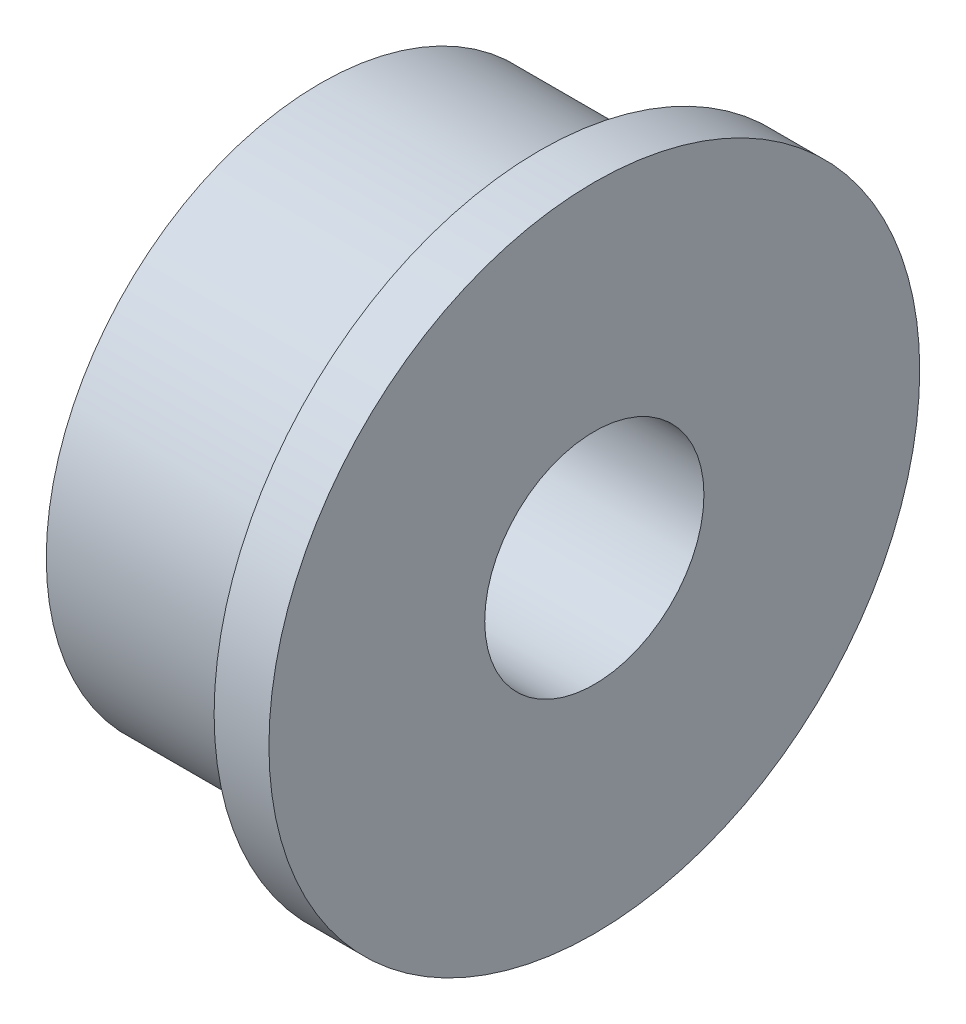
ISO-10303-21;
HEADER;
FILE_DESCRIPTION(('STEP AP214'),'2;1');
FILE_NAME('part.step','',(''),(''),'','','');
FILE_SCHEMA(('AUTOMOTIVE_DESIGN { 1 0 10303 214 1 1 1 1 }'));
ENDSEC;
DATA;
#1=APPLICATION_CONTEXT('core data for automotive mechanical design processes');
#2=APPLICATION_PROTOCOL_DEFINITION('international standard','automotive_design',2000,#1);
#3=PRODUCT_CONTEXT('',#1,'mechanical');
#4=PRODUCT('Part','Part','',(#3));
#5=PRODUCT_RELATED_PRODUCT_CATEGORY('part','',(#4));
#6=PRODUCT_DEFINITION_FORMATION('','',#4);
#7=PRODUCT_DEFINITION_CONTEXT('part definition',#1,'design');
#8=PRODUCT_DEFINITION('design','',#6,#7);
#9=PRODUCT_DEFINITION_SHAPE('','',#8);
#10=(LENGTH_UNIT() NAMED_UNIT(*) SI_UNIT(.MILLI.,.METRE.));
#11=(NAMED_UNIT(*) PLANE_ANGLE_UNIT() SI_UNIT($,.RADIAN.));
#12=(NAMED_UNIT(*) SI_UNIT($,.STERADIAN.) SOLID_ANGLE_UNIT());
#13=UNCERTAINTY_MEASURE_WITH_UNIT(LENGTH_MEASURE(1.E-05),#10,'distance_accuracy_value','');
#14=(GEOMETRIC_REPRESENTATION_CONTEXT(3) GLOBAL_UNCERTAINTY_ASSIGNED_CONTEXT((#13)) GLOBAL_UNIT_ASSIGNED_CONTEXT((#10,
#11,#12)) REPRESENTATION_CONTEXT('',''));
#15=CARTESIAN_POINT('',(0.,0.,0.));
#16=DIRECTION('',(0.,0.,1.));
#17=DIRECTION('',(1.,0.,0.));
#18=AXIS2_PLACEMENT_3D('',#15,#16,#17);
#19=CARTESIAN_POINT('',(-14.3753340595286,1.34629579981506,25.8752462228337));
#20=DIRECTION('',(1.,0.,0.));
#21=DIRECTION('',(0.,1.,0.));
#22=AXIS2_PLACEMENT_3D('',#19,#20,#21);
#23=CYLINDRICAL_SURFACE('',#22,1.6);
#24=CARTESIAN_POINT('',(-12.3753340595286,1.34629579981504,25.8752462228327));
#25=DIRECTION('',(-1.,0.,0.));
#26=DIRECTION('',(0.,0.,-1.));
#27=AXIS2_PLACEMENT_3D('',#24,#25,#26);
#28=CIRCLE('',#27,1.60000000000006);
#29=CARTESIAN_POINT('',(-12.3753340595286,1.34629579981506,24.2752462228326));
#30=VERTEX_POINT('',#29);
#31=EDGE_CURVE('E10',#30,#30,#28,.T.);
#32=ORIENTED_EDGE('',*,*,#31,.F.);
#33=EDGE_LOOP('',(#32));
#34=FACE_BOUND('',#33,.T.);
#35=CARTESIAN_POINT('',(-16.3753340595286,1.34629579981505,25.8752462228327));
#36=DIRECTION('',(1.,0.,0.));
#37=DIRECTION('',(0.,0.,-1.));
#38=AXIS2_PLACEMENT_3D('',#35,#36,#37);
#39=CIRCLE('',#38,1.6);
#40=CARTESIAN_POINT('',(-16.3753340595286,1.34629579981506,24.2752462228327));
#41=VERTEX_POINT('',#40);
#42=EDGE_CURVE('E39',#41,#41,#39,.T.);
#43=ORIENTED_EDGE('',*,*,#42,.F.);
#44=EDGE_LOOP('',(#43));
#45=FACE_BOUND('',#44,.T.);
#46=ADVANCED_FACE('F15',(#34,#45),#23,.F.);
#47=CARTESIAN_POINT('',(-13.1753340595286,7.04653579981503,31.5754862228327));
#48=DIRECTION('',(-1.,0.,0.));
#49=DIRECTION('',(0.,0.,1.));
#50=AXIS2_PLACEMENT_3D('',#47,#48,#49);
#51=PLANE('',#50);
#52=CARTESIAN_POINT('',(-13.1753340595286,1.34629579981505,25.8752462228327));
#53=DIRECTION('',(-1.,0.,0.));
#54=DIRECTION('',(0.,0.,1.));
#55=AXIS2_PLACEMENT_3D('',#52,#53,#54);
#56=CIRCLE('',#55,4.);
#57=CARTESIAN_POINT('',(-13.1753340595286,1.34629579981506,29.8752462228327));
#58=VERTEX_POINT('',#57);
#59=EDGE_CURVE('E42',#58,#58,#56,.T.);
#60=ORIENTED_EDGE('',*,*,#59,.F.);
#61=EDGE_LOOP('',(#60));
#62=FACE_BOUND('',#61,.T.);
#63=CARTESIAN_POINT('',(-13.1753340595286,1.34629579981508,25.8752462228327));
#64=DIRECTION('',(1.,0.,0.));
#65=DIRECTION('',(0.,0.,-1.));
#66=AXIS2_PLACEMENT_3D('',#63,#64,#65);
#67=CIRCLE('',#66,4.74999999999997);
#68=CARTESIAN_POINT('',(-13.1753340595286,1.34629579981506,21.1252462228327));
#69=VERTEX_POINT('',#68);
#70=EDGE_CURVE('E33',#69,#69,#67,.T.);
#71=ORIENTED_EDGE('',*,*,#70,.F.);
#72=EDGE_LOOP('',(#71));
#73=FACE_BOUND('',#72,.T.);
#74=ADVANCED_FACE('F72',(#62,#73),#51,.T.);
#75=CARTESIAN_POINT('',(-12.3753340595286,7.04653579981503,20.1750062228327));
#76=DIRECTION('',(1.,0.,0.));
#77=DIRECTION('',(0.,1.,0.));
#78=AXIS2_PLACEMENT_3D('',#75,#76,#77);
#79=PLANE('',#78);
#80=ORIENTED_EDGE('',*,*,#31,.T.);
#81=EDGE_LOOP('',(#80));
#82=FACE_BOUND('',#81,.T.);
#83=CARTESIAN_POINT('',(-12.3753340595286,1.34629579981503,25.8752462228327));
#84=DIRECTION('',(-1.,0.,0.));
#85=DIRECTION('',(0.,0.,1.));
#86=AXIS2_PLACEMENT_3D('',#83,#84,#85);
#87=CIRCLE('',#86,4.75);
#88=CARTESIAN_POINT('',(-12.3753340595286,1.34629579981506,30.6252462228327));
#89=VERTEX_POINT('',#88);
#90=EDGE_CURVE('E23',#89,#89,#87,.T.);
#91=ORIENTED_EDGE('',*,*,#90,.F.);
#92=EDGE_LOOP('',(#91));
#93=FACE_BOUND('',#92,.T.);
#94=ADVANCED_FACE('F68',(#82,#93),#79,.T.);
#95=CARTESIAN_POINT('',(-12.7753340595286,1.34629579981506,25.8752462228327));
#96=DIRECTION('',(-1.,0.,0.));
#97=DIRECTION('',(0.,-1.,0.));
#98=AXIS2_PLACEMENT_3D('',#95,#96,#97);
#99=CYLINDRICAL_SURFACE('',#98,4.75);
#100=ORIENTED_EDGE('',*,*,#70,.T.);
#101=EDGE_LOOP('',(#100));
#102=FACE_BOUND('',#101,.T.);
#103=ORIENTED_EDGE('',*,*,#90,.T.);
#104=EDGE_LOOP('',(#103));
#105=FACE_BOUND('',#104,.T.);
#106=ADVANCED_FACE('F59',(#102,#105),#99,.T.);
#107=CARTESIAN_POINT('',(-16.3753340595286,6.1465357998151,30.6754862228327));
#108=DIRECTION('',(-1.,0.,0.));
#109=DIRECTION('',(0.,0.,1.));
#110=AXIS2_PLACEMENT_3D('',#107,#108,#109);
#111=PLANE('',#110);
#112=ORIENTED_EDGE('',*,*,#42,.T.);
#113=EDGE_LOOP('',(#112));
#114=FACE_BOUND('',#113,.T.);
#115=CARTESIAN_POINT('',(-16.3753340595286,1.34629579981509,25.8752462228327));
#116=DIRECTION('',(1.,0.,0.));
#117=DIRECTION('',(0.,0.,-1.));
#118=AXIS2_PLACEMENT_3D('',#115,#116,#117);
#119=CIRCLE('',#118,3.99999999999997);
#120=CARTESIAN_POINT('',(-16.3753340595286,1.34629579981506,21.8752462228327));
#121=VERTEX_POINT('',#120);
#122=EDGE_CURVE('E18',#121,#121,#119,.T.);
#123=ORIENTED_EDGE('',*,*,#122,.F.);
#124=EDGE_LOOP('',(#123));
#125=FACE_BOUND('',#124,.T.);
#126=ADVANCED_FACE('F57',(#114,#125),#111,.T.);
#127=CARTESIAN_POINT('',(-14.7753340595286,1.34629579981506,25.8752462228327));
#128=DIRECTION('',(-1.,0.,0.));
#129=DIRECTION('',(0.,-1.,0.));
#130=AXIS2_PLACEMENT_3D('',#127,#128,#129);
#131=CYLINDRICAL_SURFACE('',#130,4.00000000000006);
#132=ORIENTED_EDGE('',*,*,#122,.T.);
#133=EDGE_LOOP('',(#132));
#134=FACE_BOUND('',#133,.T.);
#135=ORIENTED_EDGE('',*,*,#59,.T.);
#136=EDGE_LOOP('',(#135));
#137=FACE_BOUND('',#136,.T.);
#138=ADVANCED_FACE('F55',(#134,#137),#131,.T.);
#139=CLOSED_SHELL('',(#46,#74,#94,#106,#126,#138));
#140=MANIFOLD_SOLID_BREP('B1',#139);
#141=ADVANCED_BREP_SHAPE_REPRESENTATION('',(#18,#140),#14);
#142=SHAPE_DEFINITION_REPRESENTATION(#9,#141);
ENDSEC;
END-ISO-10303-21;
